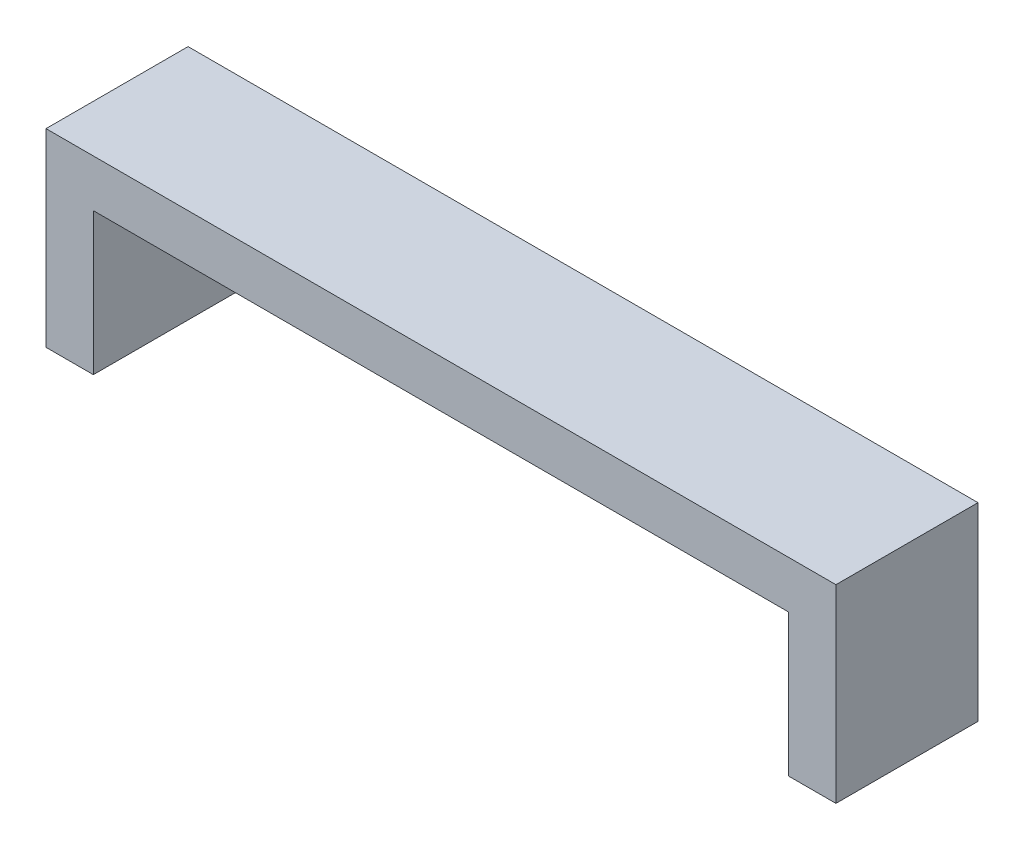
ISO-10303-21;
HEADER;
FILE_DESCRIPTION(('STEP AP214'),'2;1');
FILE_NAME('part.step','',(''),(''),'','','');
FILE_SCHEMA(('AUTOMOTIVE_DESIGN { 1 0 10303 214 1 1 1 1 }'));
ENDSEC;
DATA;
#1=APPLICATION_CONTEXT('core data for automotive mechanical design processes');
#2=APPLICATION_PROTOCOL_DEFINITION('international standard','automotive_design',2000,#1);
#3=PRODUCT_CONTEXT('',#1,'mechanical');
#4=PRODUCT('Part','Part','',(#3));
#5=PRODUCT_RELATED_PRODUCT_CATEGORY('part','',(#4));
#6=PRODUCT_DEFINITION_FORMATION('','',#4);
#7=PRODUCT_DEFINITION_CONTEXT('part definition',#1,'design');
#8=PRODUCT_DEFINITION('design','',#6,#7);
#9=PRODUCT_DEFINITION_SHAPE('','',#8);
#10=(LENGTH_UNIT() NAMED_UNIT(*) SI_UNIT(.MILLI.,.METRE.));
#11=(NAMED_UNIT(*) PLANE_ANGLE_UNIT() SI_UNIT($,.RADIAN.));
#12=(NAMED_UNIT(*) SI_UNIT($,.STERADIAN.) SOLID_ANGLE_UNIT());
#13=UNCERTAINTY_MEASURE_WITH_UNIT(LENGTH_MEASURE(1.E-05),#10,'distance_accuracy_value','');
#14=(GEOMETRIC_REPRESENTATION_CONTEXT(3) GLOBAL_UNCERTAINTY_ASSIGNED_CONTEXT((#13)) GLOBAL_UNIT_ASSIGNED_CONTEXT((#10,
#11,#12)) REPRESENTATION_CONTEXT('',''));
#15=CARTESIAN_POINT('',(0.,0.,0.));
#16=DIRECTION('',(0.,0.,1.));
#17=DIRECTION('',(1.,0.,0.));
#18=AXIS2_PLACEMENT_3D('',#15,#16,#17);
#19=CARTESIAN_POINT('',(-26.4795,-4.7625,3.175));
#20=DIRECTION('',(0.,1.,0.));
#21=DIRECTION('',(-1.,0.,0.));
#22=AXIS2_PLACEMENT_3D('',#19,#20,#21);
#23=PLANE('',#22);
#24=DIRECTION('',(0.,0.,1.));
#25=VECTOR('',#24,1.);
#26=CARTESIAN_POINT('',(-23.3045,-4.7625,3.175));
#27=LINE('',#26,#25);
#28=CARTESIAN_POINT('',(-23.3045,-4.7625,0.));
#29=VERTEX_POINT('',#28);
#30=CARTESIAN_POINT('',(-23.3045,-4.7625,3.175));
#31=VERTEX_POINT('',#30);
#32=EDGE_CURVE('E175',#29,#31,#27,.T.);
#33=ORIENTED_EDGE('',*,*,#32,.F.);
#34=DIRECTION('',(1.,0.,0.));
#35=VECTOR('',#34,1.);
#36=CARTESIAN_POINT('',(-26.4795,-4.7625,0.));
#37=LINE('',#36,#35);
#38=CARTESIAN_POINT('',(23.3045,-4.7625,0.));
#39=VERTEX_POINT('',#38);
#40=EDGE_CURVE('E181',#29,#39,#37,.T.);
#41=ORIENTED_EDGE('',*,*,#40,.T.);
#42=DIRECTION('',(0.,0.,-1.));
#43=VECTOR('',#42,1.);
#44=CARTESIAN_POINT('',(23.3045,-4.7625,3.175));
#45=LINE('',#44,#43);
#46=CARTESIAN_POINT('',(23.3045,-4.7625,3.175));
#47=VERTEX_POINT('',#46);
#48=EDGE_CURVE('E169',#47,#39,#45,.T.);
#49=ORIENTED_EDGE('',*,*,#48,.F.);
#50=DIRECTION('',(1.,0.,0.));
#51=VECTOR('',#50,1.);
#52=CARTESIAN_POINT('',(-26.4795,-4.7625,3.175));
#53=LINE('',#52,#51);
#54=EDGE_CURVE('E117',#31,#47,#53,.T.);
#55=ORIENTED_EDGE('',*,*,#54,.F.);
#56=EDGE_LOOP('',(#33,#41,#49,#55));
#57=FACE_BOUND('',#56,.T.);
#58=ADVANCED_FACE('F33',(#57),#23,.F.);
#59=CARTESIAN_POINT('',(0.,0.,3.175));
#60=DIRECTION('',(0.,0.,1.));
#61=DIRECTION('',(1.,0.,0.));
#62=AXIS2_PLACEMENT_3D('',#59,#60,#61);
#63=PLANE('',#62);
#64=DIRECTION('',(-1.,0.,0.));
#65=VECTOR('',#64,1.);
#66=CARTESIAN_POINT('',(0.,1.5875,3.175));
#67=LINE('',#66,#65);
#68=CARTESIAN_POINT('',(23.3045,1.5875,3.175));
#69=VERTEX_POINT('',#68);
#70=CARTESIAN_POINT('',(-23.3045,1.5875,3.175));
#71=VERTEX_POINT('',#70);
#72=EDGE_CURVE('E48',#69,#71,#67,.T.);
#73=ORIENTED_EDGE('',*,*,#72,.T.);
#74=DIRECTION('',(0.,-1.,0.));
#75=VECTOR('',#74,1.);
#76=CARTESIAN_POINT('',(-23.3045,0.,3.175));
#77=LINE('',#76,#75);
#78=EDGE_CURVE('E173',#71,#31,#77,.T.);
#79=ORIENTED_EDGE('',*,*,#78,.T.);
#80=ORIENTED_EDGE('',*,*,#54,.T.);
#81=DIRECTION('',(0.,1.,0.));
#82=VECTOR('',#81,1.);
#83=CARTESIAN_POINT('',(23.3045,0.,3.175));
#84=LINE('',#83,#82);
#85=EDGE_CURVE('E53',#47,#69,#84,.T.);
#86=ORIENTED_EDGE('',*,*,#85,.T.);
#87=EDGE_LOOP('',(#73,#79,#80,#86));
#88=FACE_BOUND('',#87,.T.);
#89=ADVANCED_FACE('F215',(#88),#63,.T.);
#90=CARTESIAN_POINT('',(-26.4795,4.7625,3.175));
#91=DIRECTION('',(1.,0.,0.));
#92=DIRECTION('',(0.,0.,-1.));
#93=AXIS2_PLACEMENT_3D('',#90,#91,#92);
#94=PLANE('',#93);
#95=DIRECTION('',(0.,-1.,0.));
#96=VECTOR('',#95,1.);
#97=CARTESIAN_POINT('',(-26.4795,4.7625,0.));
#98=LINE('',#97,#96);
#99=CARTESIAN_POINT('',(-26.4795,4.7625,0.));
#100=VERTEX_POINT('',#99);
#101=CARTESIAN_POINT('',(-26.4795,-7.9375,0.));
#102=VERTEX_POINT('',#101);
#103=EDGE_CURVE('E178',#100,#102,#98,.T.);
#104=ORIENTED_EDGE('',*,*,#103,.T.);
#105=DIRECTION('',(0.,0.,-1.));
#106=VECTOR('',#105,1.);
#107=CARTESIAN_POINT('',(-26.4795,-7.9375,9.525));
#108=LINE('',#107,#106);
#109=CARTESIAN_POINT('',(-26.4795,-7.9375,9.525));
#110=VERTEX_POINT('',#109);
#111=EDGE_CURVE('E121',#110,#102,#108,.T.);
#112=ORIENTED_EDGE('',*,*,#111,.F.);
#113=DIRECTION('',(0.,-1.,0.));
#114=VECTOR('',#113,1.);
#115=CARTESIAN_POINT('',(-26.4795,4.7625,9.525));
#116=LINE('',#115,#114);
#117=CARTESIAN_POINT('',(-26.4795,4.7625,9.525));
#118=VERTEX_POINT('',#117);
#119=EDGE_CURVE('E119',#118,#110,#116,.T.);
#120=ORIENTED_EDGE('',*,*,#119,.F.);
#121=DIRECTION('',(0.,0.,-1.));
#122=VECTOR('',#121,1.);
#123=CARTESIAN_POINT('',(-26.4795,4.7625,3.175));
#124=LINE('',#123,#122);
#125=EDGE_CURVE('E41',#118,#100,#124,.T.);
#126=ORIENTED_EDGE('',*,*,#125,.T.);
#127=EDGE_LOOP('',(#104,#112,#120,#126));
#128=FACE_BOUND('',#127,.T.);
#129=ADVANCED_FACE('F35',(#128),#94,.F.);
#130=CARTESIAN_POINT('',(26.4795,4.7625,3.175));
#131=DIRECTION('',(-1.,0.,0.));
#132=DIRECTION('',(0.,0.,1.));
#133=AXIS2_PLACEMENT_3D('',#130,#131,#132);
#134=PLANE('',#133);
#135=DIRECTION('',(0.,0.,-1.));
#136=VECTOR('',#135,1.);
#137=CARTESIAN_POINT('',(26.4795,-7.93749999999999,9.525));
#138=LINE('',#137,#136);
#139=CARTESIAN_POINT('',(26.4795,-7.93749999999999,9.525));
#140=VERTEX_POINT('',#139);
#141=CARTESIAN_POINT('',(26.4795,-7.93749999999999,0.));
#142=VERTEX_POINT('',#141);
#143=EDGE_CURVE('E146',#140,#142,#138,.T.);
#144=ORIENTED_EDGE('',*,*,#143,.T.);
#145=DIRECTION('',(0.,1.,0.));
#146=VECTOR('',#145,1.);
#147=CARTESIAN_POINT('',(26.4795,4.7625,0.));
#148=LINE('',#147,#146);
#149=CARTESIAN_POINT('',(26.4795,4.7625,0.));
#150=VERTEX_POINT('',#149);
#151=EDGE_CURVE('E183',#142,#150,#148,.T.);
#152=ORIENTED_EDGE('',*,*,#151,.T.);
#153=DIRECTION('',(0.,0.,-1.));
#154=VECTOR('',#153,1.);
#155=CARTESIAN_POINT('',(26.4795,4.7625,3.175));
#156=LINE('',#155,#154);
#157=CARTESIAN_POINT('',(26.4795,4.7625,9.525));
#158=VERTEX_POINT('',#157);
#159=EDGE_CURVE('E11',#158,#150,#156,.T.);
#160=ORIENTED_EDGE('',*,*,#159,.F.);
#161=DIRECTION('',(0.,1.,0.));
#162=VECTOR('',#161,1.);
#163=CARTESIAN_POINT('',(26.4795,-7.93749999999999,9.525));
#164=LINE('',#163,#162);
#165=EDGE_CURVE('E129',#140,#158,#164,.T.);
#166=ORIENTED_EDGE('',*,*,#165,.F.);
#167=EDGE_LOOP('',(#144,#152,#160,#166));
#168=FACE_BOUND('',#167,.T.);
#169=ADVANCED_FACE('F186',(#168),#134,.F.);
#170=CARTESIAN_POINT('',(-26.4795,4.7625,3.175));
#171=DIRECTION('',(0.,-1.,0.));
#172=DIRECTION('',(1.,0.,0.));
#173=AXIS2_PLACEMENT_3D('',#170,#171,#172);
#174=PLANE('',#173);
#175=DIRECTION('',(-1.,0.,0.));
#176=VECTOR('',#175,1.);
#177=CARTESIAN_POINT('',(-26.4795,4.7625,0.));
#178=LINE('',#177,#176);
#179=EDGE_CURVE('E114',#150,#100,#178,.T.);
#180=ORIENTED_EDGE('',*,*,#179,.T.);
#181=ORIENTED_EDGE('',*,*,#125,.F.);
#182=DIRECTION('',(-1.,0.,0.));
#183=VECTOR('',#182,1.);
#184=CARTESIAN_POINT('',(26.4795,4.7625,9.525));
#185=LINE('',#184,#183);
#186=EDGE_CURVE('E112',#158,#118,#185,.T.);
#187=ORIENTED_EDGE('',*,*,#186,.F.);
#188=ORIENTED_EDGE('',*,*,#159,.T.);
#189=EDGE_LOOP('',(#180,#181,#187,#188));
#190=FACE_BOUND('',#189,.T.);
#191=ADVANCED_FACE('F110',(#190),#174,.F.);
#192=CARTESIAN_POINT('',(0.,0.,0.));
#193=DIRECTION('',(0.,0.,1.));
#194=DIRECTION('',(1.,0.,0.));
#195=AXIS2_PLACEMENT_3D('',#192,#193,#194);
#196=PLANE('',#195);
#197=ORIENTED_EDGE('',*,*,#40,.F.);
#198=DIRECTION('',(0.,1.,0.));
#199=VECTOR('',#198,1.);
#200=CARTESIAN_POINT('',(-23.3045,-7.9375,0.));
#201=LINE('',#200,#199);
#202=CARTESIAN_POINT('',(-23.3045,-7.9375,0.));
#203=VERTEX_POINT('',#202);
#204=EDGE_CURVE('E149',#203,#29,#201,.T.);
#205=ORIENTED_EDGE('',*,*,#204,.F.);
#206=DIRECTION('',(1.,0.,0.));
#207=VECTOR('',#206,1.);
#208=CARTESIAN_POINT('',(-26.4795,-7.9375,0.));
#209=LINE('',#208,#207);
#210=EDGE_CURVE('E147',#102,#203,#209,.T.);
#211=ORIENTED_EDGE('',*,*,#210,.F.);
#212=ORIENTED_EDGE('',*,*,#103,.F.);
#213=ORIENTED_EDGE('',*,*,#179,.F.);
#214=ORIENTED_EDGE('',*,*,#151,.F.);
#215=DIRECTION('',(1.,0.,0.));
#216=VECTOR('',#215,1.);
#217=CARTESIAN_POINT('',(23.3045,-7.93749999999999,0.));
#218=LINE('',#217,#216);
#219=CARTESIAN_POINT('',(23.3045,-7.93749999999999,0.));
#220=VERTEX_POINT('',#219);
#221=EDGE_CURVE('E130',#220,#142,#218,.T.);
#222=ORIENTED_EDGE('',*,*,#221,.F.);
#223=DIRECTION('',(0.,-1.,0.));
#224=VECTOR('',#223,1.);
#225=CARTESIAN_POINT('',(23.3045,1.5875,0.));
#226=LINE('',#225,#224);
#227=EDGE_CURVE('E133',#39,#220,#226,.T.);
#228=ORIENTED_EDGE('',*,*,#227,.F.);
#229=EDGE_LOOP('',(#197,#205,#211,#212,#213,#214,#222,#228));
#230=FACE_BOUND('',#229,.T.);
#231=ADVANCED_FACE('F191',(#230),#196,.F.);
#232=CARTESIAN_POINT('',(-23.3045,-7.9375,9.525));
#233=DIRECTION('',(-1.,0.,0.));
#234=DIRECTION('',(0.,-1.,0.));
#235=AXIS2_PLACEMENT_3D('',#232,#233,#234);
#236=PLANE('',#235);
#237=ORIENTED_EDGE('',*,*,#204,.T.);
#238=ORIENTED_EDGE('',*,*,#32,.T.);
#239=ORIENTED_EDGE('',*,*,#78,.F.);
#240=DIRECTION('',(0.,0.,-1.));
#241=VECTOR('',#240,1.);
#242=CARTESIAN_POINT('',(-23.3045,1.5875,9.525));
#243=LINE('',#242,#241);
#244=CARTESIAN_POINT('',(-23.3045,1.5875,9.525));
#245=VERTEX_POINT('',#244);
#246=EDGE_CURVE('E161',#245,#71,#243,.T.);
#247=ORIENTED_EDGE('',*,*,#246,.F.);
#248=DIRECTION('',(0.,1.,0.));
#249=VECTOR('',#248,1.);
#250=CARTESIAN_POINT('',(-23.3045,-7.9375,9.525));
#251=LINE('',#250,#249);
#252=CARTESIAN_POINT('',(-23.3045,-7.9375,9.525));
#253=VERTEX_POINT('',#252);
#254=EDGE_CURVE('E137',#253,#245,#251,.T.);
#255=ORIENTED_EDGE('',*,*,#254,.F.);
#256=DIRECTION('',(0.,0.,-1.));
#257=VECTOR('',#256,1.);
#258=CARTESIAN_POINT('',(-23.3045,-7.9375,9.525));
#259=LINE('',#258,#257);
#260=EDGE_CURVE('E164',#253,#203,#259,.T.);
#261=ORIENTED_EDGE('',*,*,#260,.T.);
#262=EDGE_LOOP('',(#237,#238,#239,#247,#255,#261));
#263=FACE_BOUND('',#262,.T.);
#264=ADVANCED_FACE('F202',(#263),#236,.F.);
#265=CARTESIAN_POINT('',(23.3045,1.5875,9.525));
#266=DIRECTION('',(1.,0.,0.));
#267=DIRECTION('',(0.,1.,0.));
#268=AXIS2_PLACEMENT_3D('',#265,#266,#267);
#269=PLANE('',#268);
#270=ORIENTED_EDGE('',*,*,#85,.F.);
#271=ORIENTED_EDGE('',*,*,#48,.T.);
#272=ORIENTED_EDGE('',*,*,#227,.T.);
#273=DIRECTION('',(0.,0.,-1.));
#274=VECTOR('',#273,1.);
#275=CARTESIAN_POINT('',(23.3045,-7.93749999999999,9.525));
#276=LINE('',#275,#274);
#277=CARTESIAN_POINT('',(23.3045,-7.93749999999999,9.525));
#278=VERTEX_POINT('',#277);
#279=EDGE_CURVE('E155',#278,#220,#276,.T.);
#280=ORIENTED_EDGE('',*,*,#279,.F.);
#281=DIRECTION('',(0.,-1.,0.));
#282=VECTOR('',#281,1.);
#283=CARTESIAN_POINT('',(23.3045,1.5875,9.525));
#284=LINE('',#283,#282);
#285=CARTESIAN_POINT('',(23.3045,1.5875,9.525));
#286=VERTEX_POINT('',#285);
#287=EDGE_CURVE('E141',#286,#278,#284,.T.);
#288=ORIENTED_EDGE('',*,*,#287,.F.);
#289=DIRECTION('',(0.,0.,-1.));
#290=VECTOR('',#289,1.);
#291=CARTESIAN_POINT('',(23.3045,1.5875,9.525));
#292=LINE('',#291,#290);
#293=EDGE_CURVE('E158',#286,#69,#292,.T.);
#294=ORIENTED_EDGE('',*,*,#293,.T.);
#295=EDGE_LOOP('',(#270,#271,#272,#280,#288,#294));
#296=FACE_BOUND('',#295,.T.);
#297=ADVANCED_FACE('F208',(#296),#269,.F.);
#298=CARTESIAN_POINT('',(-26.4795,-7.9375,9.525));
#299=DIRECTION('',(0.,1.,0.));
#300=DIRECTION('',(0.,0.,1.));
#301=AXIS2_PLACEMENT_3D('',#298,#299,#300);
#302=PLANE('',#301);
#303=ORIENTED_EDGE('',*,*,#210,.T.);
#304=ORIENTED_EDGE('',*,*,#260,.F.);
#305=DIRECTION('',(1.,0.,0.));
#306=VECTOR('',#305,1.);
#307=CARTESIAN_POINT('',(-26.4795,-7.9375,9.525));
#308=LINE('',#307,#306);
#309=EDGE_CURVE('E124',#110,#253,#308,.T.);
#310=ORIENTED_EDGE('',*,*,#309,.F.);
#311=ORIENTED_EDGE('',*,*,#111,.T.);
#312=EDGE_LOOP('',(#303,#304,#310,#311));
#313=FACE_BOUND('',#312,.T.);
#314=ADVANCED_FACE('F195',(#313),#302,.F.);
#315=CARTESIAN_POINT('',(-23.3045,1.5875,9.525));
#316=DIRECTION('',(0.,1.,0.));
#317=DIRECTION('',(0.,0.,1.));
#318=AXIS2_PLACEMENT_3D('',#315,#316,#317);
#319=PLANE('',#318);
#320=ORIENTED_EDGE('',*,*,#72,.F.);
#321=ORIENTED_EDGE('',*,*,#293,.F.);
#322=DIRECTION('',(1.,0.,0.));
#323=VECTOR('',#322,1.);
#324=CARTESIAN_POINT('',(-23.3045,1.5875,9.525));
#325=LINE('',#324,#323);
#326=EDGE_CURVE('E139',#245,#286,#325,.T.);
#327=ORIENTED_EDGE('',*,*,#326,.F.);
#328=ORIENTED_EDGE('',*,*,#246,.T.);
#329=EDGE_LOOP('',(#320,#321,#327,#328));
#330=FACE_BOUND('',#329,.T.);
#331=ADVANCED_FACE('F204',(#330),#319,.F.);
#332=CARTESIAN_POINT('',(23.3045,-7.93749999999999,9.525));
#333=DIRECTION('',(0.,1.,0.));
#334=DIRECTION('',(-1.,0.,0.));
#335=AXIS2_PLACEMENT_3D('',#332,#333,#334);
#336=PLANE('',#335);
#337=ORIENTED_EDGE('',*,*,#221,.T.);
#338=ORIENTED_EDGE('',*,*,#143,.F.);
#339=DIRECTION('',(1.,0.,0.));
#340=VECTOR('',#339,1.);
#341=CARTESIAN_POINT('',(23.3045,-7.93749999999999,9.525));
#342=LINE('',#341,#340);
#343=EDGE_CURVE('E143',#278,#140,#342,.T.);
#344=ORIENTED_EDGE('',*,*,#343,.F.);
#345=ORIENTED_EDGE('',*,*,#279,.T.);
#346=EDGE_LOOP('',(#337,#338,#344,#345));
#347=FACE_BOUND('',#346,.T.);
#348=ADVANCED_FACE('F211',(#347),#336,.F.);
#349=CARTESIAN_POINT('',(0.,0.,9.525));
#350=DIRECTION('',(0.,0.,1.));
#351=DIRECTION('',(1.,0.,0.));
#352=AXIS2_PLACEMENT_3D('',#349,#350,#351);
#353=PLANE('',#352);
#354=ORIENTED_EDGE('',*,*,#186,.T.);
#355=ORIENTED_EDGE('',*,*,#119,.T.);
#356=ORIENTED_EDGE('',*,*,#309,.T.);
#357=ORIENTED_EDGE('',*,*,#254,.T.);
#358=ORIENTED_EDGE('',*,*,#326,.T.);
#359=ORIENTED_EDGE('',*,*,#287,.T.);
#360=ORIENTED_EDGE('',*,*,#343,.T.);
#361=ORIENTED_EDGE('',*,*,#165,.T.);
#362=EDGE_LOOP('',(#354,#355,#356,#357,#358,#359,#360,#361));
#363=FACE_BOUND('',#362,.T.);
#364=ADVANCED_FACE('F127',(#363),#353,.T.);
#365=CLOSED_SHELL('',(#58,#89,#129,#169,#191,#231,#264,#297,#314,#331,#348,#364));
#366=MANIFOLD_SOLID_BREP('B2',#365);
#367=ADVANCED_BREP_SHAPE_REPRESENTATION('',(#18,#366),#14);
#368=SHAPE_DEFINITION_REPRESENTATION(#9,#367);
ENDSEC;
END-ISO-10303-21;
